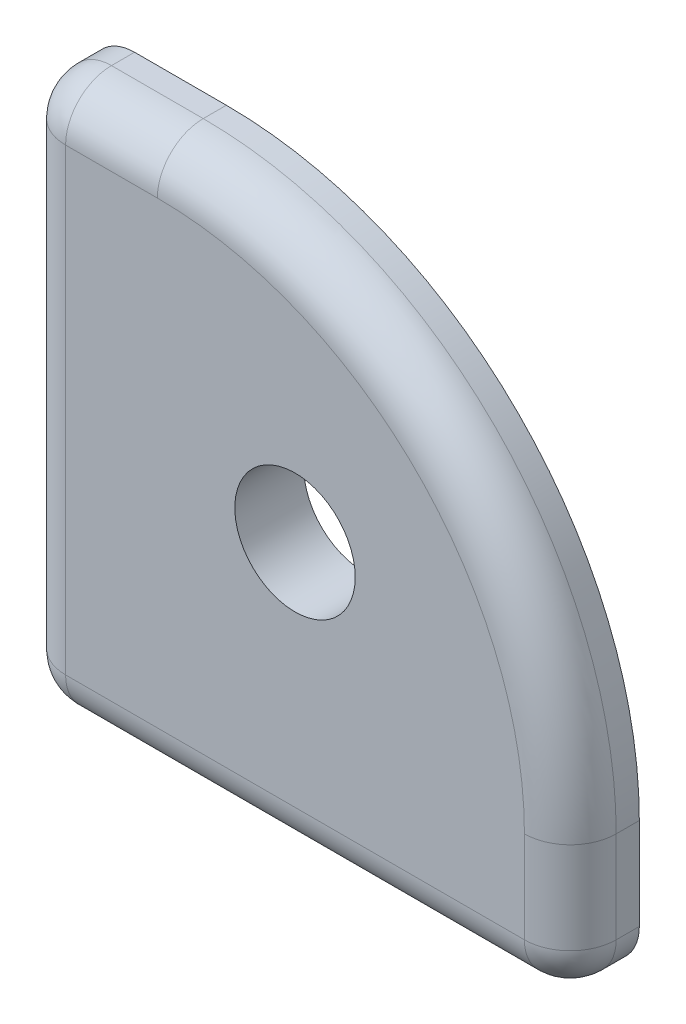
ISO-10303-21;
HEADER;
FILE_DESCRIPTION(('STEP AP214'),'2;1');
FILE_NAME('part.step','',(''),(''),'','','');
FILE_SCHEMA(('AUTOMOTIVE_DESIGN { 1 0 10303 214 1 1 1 1 }'));
ENDSEC;
DATA;
#1=APPLICATION_CONTEXT('core data for automotive mechanical design processes');
#2=APPLICATION_PROTOCOL_DEFINITION('international standard','automotive_design',2000,#1);
#3=PRODUCT_CONTEXT('',#1,'mechanical');
#4=PRODUCT('Part','Part','',(#3));
#5=PRODUCT_RELATED_PRODUCT_CATEGORY('part','',(#4));
#6=PRODUCT_DEFINITION_FORMATION('','',#4);
#7=PRODUCT_DEFINITION_CONTEXT('part definition',#1,'design');
#8=PRODUCT_DEFINITION('design','',#6,#7);
#9=PRODUCT_DEFINITION_SHAPE('','',#8);
#10=(LENGTH_UNIT() NAMED_UNIT(*) SI_UNIT(.MILLI.,.METRE.));
#11=(NAMED_UNIT(*) PLANE_ANGLE_UNIT() SI_UNIT($,.RADIAN.));
#12=(NAMED_UNIT(*) SI_UNIT($,.STERADIAN.) SOLID_ANGLE_UNIT());
#13=UNCERTAINTY_MEASURE_WITH_UNIT(LENGTH_MEASURE(1.E-05),#10,'distance_accuracy_value','');
#14=(GEOMETRIC_REPRESENTATION_CONTEXT(3) GLOBAL_UNCERTAINTY_ASSIGNED_CONTEXT((#13)) GLOBAL_UNIT_ASSIGNED_CONTEXT((#10,
#11,#12)) REPRESENTATION_CONTEXT('',''));
#15=CARTESIAN_POINT('',(0.,0.,0.));
#16=DIRECTION('',(0.,0.,1.));
#17=DIRECTION('',(1.,0.,0.));
#18=AXIS2_PLACEMENT_3D('',#15,#16,#17);
#19=CARTESIAN_POINT('',(20.8940286291501,-16.6704350284402,0.));
#20=DIRECTION('',(0.,0.,1.));
#21=DIRECTION('',(1.,0.,0.));
#22=AXIS2_PLACEMENT_3D('',#19,#20,#21);
#23=PLANE('',#22);
#24=CARTESIAN_POINT('',(29.9110286291501,10.6489863277971,0.));
#25=DIRECTION('',(0.,0.,1.));
#26=DIRECTION('',(1.,0.,0.));
#27=AXIS2_PLACEMENT_3D('',#24,#25,#26);
#28=CIRCLE('',#27,1.2065);
#29=CARTESIAN_POINT('',(31.1175286291501,10.6489863277971,0.));
#30=VERTEX_POINT('',#29);
#31=EDGE_CURVE('E228',#30,#30,#28,.F.);
#32=ORIENTED_EDGE('',*,*,#31,.F.);
#33=EDGE_LOOP('',(#32));
#34=FACE_BOUND('',#33,.T.);
#35=CARTESIAN_POINT('',(20.8940286291501,25.3809863277971,0.));
#36=DIRECTION('',(0.,0.,1.));
#37=DIRECTION('',(1.,0.,0.));
#38=AXIS2_PLACEMENT_3D('',#35,#36,#37);
#39=CIRCLE('',#38,4.16559999999999);
#40=CARTESIAN_POINT('',(25.0596286291501,25.3809863277971,0.));
#41=VERTEX_POINT('',#40);
#42=EDGE_CURVE('E154',#41,#41,#39,.T.);
#43=ORIENTED_EDGE('',*,*,#42,.T.);
#44=EDGE_LOOP('',(#43));
#45=FACE_BOUND('',#44,.T.);
#46=DIRECTION('',(0.,1.,0.));
#47=VECTOR('',#46,1.);
#48=CARTESIAN_POINT('',(39.9440286291501,-16.6704350284402,0.));
#49=LINE('',#48,#47);
#50=CARTESIAN_POINT('',(39.9440286291501,9.50598632779709,0.));
#51=VERTEX_POINT('',#50);
#52=CARTESIAN_POINT('',(39.9440286291501,15.8559863277971,0.));
#53=VERTEX_POINT('',#52);
#54=EDGE_CURVE('E143',#51,#53,#49,.T.);
#55=ORIENTED_EDGE('',*,*,#54,.F.);
#56=CARTESIAN_POINT('',(36.7690286291501,9.50598632779709,0.));
#57=DIRECTION('',(0.,0.,1.));
#58=DIRECTION('',(1.,0.,0.));
#59=AXIS2_PLACEMENT_3D('',#56,#57,#58);
#60=CIRCLE('',#59,3.17499999999999);
#61=CARTESIAN_POINT('',(36.7690286291501,6.33098632779709,0.));
#62=VERTEX_POINT('',#61);
#63=EDGE_CURVE('E179',#62,#51,#60,.T.);
#64=ORIENTED_EDGE('',*,*,#63,.F.);
#65=DIRECTION('',(1.,0.,0.));
#66=VECTOR('',#65,1.);
#67=CARTESIAN_POINT('',(20.8940286291501,6.33098632779709,0.));
#68=LINE('',#67,#66);
#69=CARTESIAN_POINT('',(5.0190286291501,6.33098632779709,0.));
#70=VERTEX_POINT('',#69);
#71=EDGE_CURVE('E175',#70,#62,#68,.T.);
#72=ORIENTED_EDGE('',*,*,#71,.F.);
#73=CARTESIAN_POINT('',(5.0190286291501,9.50598632779709,0.));
#74=DIRECTION('',(0.,0.,1.));
#75=DIRECTION('',(1.,0.,0.));
#76=AXIS2_PLACEMENT_3D('',#73,#74,#75);
#77=CIRCLE('',#76,3.175);
#78=CARTESIAN_POINT('',(1.8440286291501,9.50598632779709,0.));
#79=VERTEX_POINT('',#78);
#80=EDGE_CURVE('E171',#79,#70,#77,.T.);
#81=ORIENTED_EDGE('',*,*,#80,.F.);
#82=DIRECTION('',(0.,-1.,0.));
#83=VECTOR('',#82,1.);
#84=CARTESIAN_POINT('',(1.8440286291501,-16.6704350284402,0.));
#85=LINE('',#84,#83);
#86=CARTESIAN_POINT('',(1.8440286291501,41.2559863277971,0.));
#87=VERTEX_POINT('',#86);
#88=EDGE_CURVE('E167',#87,#79,#85,.T.);
#89=ORIENTED_EDGE('',*,*,#88,.F.);
#90=CARTESIAN_POINT('',(5.0190286291501,41.2559863277971,0.));
#91=DIRECTION('',(0.,0.,1.));
#92=DIRECTION('',(1.,0.,0.));
#93=AXIS2_PLACEMENT_3D('',#90,#91,#92);
#94=CIRCLE('',#93,3.17499999999999);
#95=CARTESIAN_POINT('',(5.0190286291501,44.4309863277971,0.));
#96=VERTEX_POINT('',#95);
#97=EDGE_CURVE('E164',#96,#87,#94,.T.);
#98=ORIENTED_EDGE('',*,*,#97,.F.);
#99=DIRECTION('',(1.,0.,0.));
#100=VECTOR('',#99,1.);
#101=CARTESIAN_POINT('',(20.8940286291501,44.4309863277971,0.));
#102=LINE('',#101,#100);
#103=CARTESIAN_POINT('',(11.3690286291501,44.4309863277971,0.));
#104=VERTEX_POINT('',#103);
#105=EDGE_CURVE('E146',#96,#104,#102,.T.);
#106=ORIENTED_EDGE('',*,*,#105,.T.);
#107=CARTESIAN_POINT('',(11.3690286291501,15.8559863277971,0.));
#108=DIRECTION('',(0.,0.,1.));
#109=DIRECTION('',(1.,0.,0.));
#110=AXIS2_PLACEMENT_3D('',#107,#108,#109);
#111=CIRCLE('',#110,28.575);
#112=EDGE_CURVE('E130',#53,#104,#111,.T.);
#113=ORIENTED_EDGE('',*,*,#112,.F.);
#114=EDGE_LOOP('',(#55,#64,#72,#81,#89,#98,#106,#113));
#115=FACE_BOUND('',#114,.T.);
#116=CARTESIAN_POINT('',(11.8770286291501,40.1129863277971,0.));
#117=DIRECTION('',(0.,0.,1.));
#118=DIRECTION('',(1.,0.,0.));
#119=AXIS2_PLACEMENT_3D('',#116,#117,#118);
#120=CIRCLE('',#119,1.2065);
#121=CARTESIAN_POINT('',(13.0835286291501,40.1129863277971,0.));
#122=VERTEX_POINT('',#121);
#123=EDGE_CURVE('E257',#122,#122,#120,.F.);
#124=ORIENTED_EDGE('',*,*,#123,.F.);
#125=EDGE_LOOP('',(#124));
#126=FACE_BOUND('',#125,.T.);
#127=ADVANCED_FACE('F40',(#34,#45,#115,#126),#23,.F.);
#128=CARTESIAN_POINT('',(39.9440286291501,-16.6704350284402,4.7752));
#129=DIRECTION('',(-1.,0.,0.));
#130=DIRECTION('',(0.,0.,1.));
#131=AXIS2_PLACEMENT_3D('',#128,#129,#130);
#132=PLANE('',#131);
#133=DIRECTION('',(0.,0.,-1.));
#134=VECTOR('',#133,1.);
#135=CARTESIAN_POINT('',(39.9440286291501,15.8559863277971,4.7752));
#136=LINE('',#135,#134);
#137=CARTESIAN_POINT('',(39.9440286291501,15.8559863277971,1.6002));
#138=VERTEX_POINT('',#137);
#139=EDGE_CURVE('E127',#138,#53,#136,.T.);
#140=ORIENTED_EDGE('',*,*,#139,.F.);
#141=DIRECTION('',(0.,1.,0.));
#142=VECTOR('',#141,1.);
#143=CARTESIAN_POINT('',(39.9440286291501,9.50598632779709,1.6002));
#144=LINE('',#143,#142);
#145=CARTESIAN_POINT('',(39.9440286291501,9.50598632779709,1.6002));
#146=VERTEX_POINT('',#145);
#147=EDGE_CURVE('E223',#138,#146,#144,.F.);
#148=ORIENTED_EDGE('',*,*,#147,.T.);
#149=DIRECTION('',(0.,0.,-1.));
#150=VECTOR('',#149,1.);
#151=CARTESIAN_POINT('',(39.9440286291501,9.50598632779709,4.7752));
#152=LINE('',#151,#150);
#153=EDGE_CURVE('E151',#146,#51,#152,.T.);
#154=ORIENTED_EDGE('',*,*,#153,.T.);
#155=ORIENTED_EDGE('',*,*,#54,.T.);
#156=EDGE_LOOP('',(#140,#148,#154,#155));
#157=FACE_BOUND('',#156,.T.);
#158=ADVANCED_FACE('F149',(#157),#132,.F.);
#159=CARTESIAN_POINT('',(11.3690286291501,15.8559863277971,4.7752));
#160=DIRECTION('',(0.,0.,-1.));
#161=DIRECTION('',(-1.,0.,0.));
#162=AXIS2_PLACEMENT_3D('',#159,#160,#161);
#163=CYLINDRICAL_SURFACE('',#162,28.575);
#164=DIRECTION('',(0.,0.,-1.));
#165=VECTOR('',#164,1.);
#166=CARTESIAN_POINT('',(11.3690286291501,44.4309863277971,4.7752));
#167=LINE('',#166,#165);
#168=CARTESIAN_POINT('',(11.3690286291501,44.4309863277971,1.6002));
#169=VERTEX_POINT('',#168);
#170=EDGE_CURVE('E137',#169,#104,#167,.T.);
#171=ORIENTED_EDGE('',*,*,#170,.F.);
#172=CARTESIAN_POINT('',(11.3690286291501,15.8559863277971,1.6002));
#173=DIRECTION('',(0.,0.,1.));
#174=DIRECTION('',(1.,0.,0.));
#175=AXIS2_PLACEMENT_3D('',#172,#173,#174);
#176=CIRCLE('',#175,28.575);
#177=EDGE_CURVE('E65',#169,#138,#176,.F.);
#178=ORIENTED_EDGE('',*,*,#177,.T.);
#179=ORIENTED_EDGE('',*,*,#139,.T.);
#180=ORIENTED_EDGE('',*,*,#112,.T.);
#181=EDGE_LOOP('',(#171,#178,#179,#180));
#182=FACE_BOUND('',#181,.T.);
#183=ADVANCED_FACE('F129',(#182),#163,.T.);
#184=CARTESIAN_POINT('',(20.8940286291501,44.4309863277971,4.7752));
#185=DIRECTION('',(0.,1.,0.));
#186=DIRECTION('',(0.,0.,1.));
#187=AXIS2_PLACEMENT_3D('',#184,#185,#186);
#188=PLANE('',#187);
#189=DIRECTION('',(0.,0.,-1.));
#190=VECTOR('',#189,1.);
#191=CARTESIAN_POINT('',(5.0190286291501,44.4309863277971,4.7752));
#192=LINE('',#191,#190);
#193=CARTESIAN_POINT('',(5.0190286291501,44.4309863277971,1.6002));
#194=VERTEX_POINT('',#193);
#195=EDGE_CURVE('E193',#194,#96,#192,.T.);
#196=ORIENTED_EDGE('',*,*,#195,.F.);
#197=DIRECTION('',(1.,0.,0.));
#198=VECTOR('',#197,1.);
#199=CARTESIAN_POINT('',(20.8940286291501,44.4309863277971,1.6002));
#200=LINE('',#199,#198);
#201=EDGE_CURVE('E55',#194,#169,#200,.T.);
#202=ORIENTED_EDGE('',*,*,#201,.T.);
#203=ORIENTED_EDGE('',*,*,#170,.T.);
#204=ORIENTED_EDGE('',*,*,#105,.F.);
#205=EDGE_LOOP('',(#196,#202,#203,#204));
#206=FACE_BOUND('',#205,.T.);
#207=ADVANCED_FACE('F309',(#206),#188,.T.);
#208=CARTESIAN_POINT('',(5.0190286291501,41.2559863277971,4.7752));
#209=DIRECTION('',(0.,0.,-1.));
#210=DIRECTION('',(-1.,0.,0.));
#211=AXIS2_PLACEMENT_3D('',#208,#209,#210);
#212=CYLINDRICAL_SURFACE('',#211,3.17499999999999);
#213=DIRECTION('',(0.,0.,-1.));
#214=VECTOR('',#213,1.);
#215=CARTESIAN_POINT('',(1.8440286291501,41.2559863277971,4.7752));
#216=LINE('',#215,#214);
#217=CARTESIAN_POINT('',(1.8440286291501,41.2559863277971,1.6002));
#218=VERTEX_POINT('',#217);
#219=EDGE_CURVE('E191',#218,#87,#216,.T.);
#220=ORIENTED_EDGE('',*,*,#219,.F.);
#221=CARTESIAN_POINT('',(5.0190286291501,41.2559863277971,1.6002));
#222=DIRECTION('',(0.,0.,-1.));
#223=DIRECTION('',(-1.,0.,0.));
#224=AXIS2_PLACEMENT_3D('',#221,#222,#223);
#225=CIRCLE('',#224,3.17499999999999);
#226=EDGE_CURVE('E136',#218,#194,#225,.T.);
#227=ORIENTED_EDGE('',*,*,#226,.T.);
#228=ORIENTED_EDGE('',*,*,#195,.T.);
#229=ORIENTED_EDGE('',*,*,#97,.T.);
#230=EDGE_LOOP('',(#220,#227,#228,#229));
#231=FACE_BOUND('',#230,.T.);
#232=ADVANCED_FACE('F305',(#231),#212,.T.);
#233=CARTESIAN_POINT('',(1.8440286291501,-16.6704350284402,4.7752));
#234=DIRECTION('',(1.,0.,0.));
#235=DIRECTION('',(0.,0.,-1.));
#236=AXIS2_PLACEMENT_3D('',#233,#234,#235);
#237=PLANE('',#236);
#238=DIRECTION('',(0.,0.,-1.));
#239=VECTOR('',#238,1.);
#240=CARTESIAN_POINT('',(1.8440286291501,9.50598632779709,4.7752));
#241=LINE('',#240,#239);
#242=CARTESIAN_POINT('',(1.8440286291501,9.50598632779709,1.6002));
#243=VERTEX_POINT('',#242);
#244=EDGE_CURVE('E188',#243,#79,#241,.T.);
#245=ORIENTED_EDGE('',*,*,#244,.F.);
#246=DIRECTION('',(0.,-1.,0.));
#247=VECTOR('',#246,1.);
#248=CARTESIAN_POINT('',(1.8440286291501,41.2559863277971,1.6002));
#249=LINE('',#248,#247);
#250=EDGE_CURVE('E213',#243,#218,#249,.F.);
#251=ORIENTED_EDGE('',*,*,#250,.T.);
#252=ORIENTED_EDGE('',*,*,#219,.T.);
#253=ORIENTED_EDGE('',*,*,#88,.T.);
#254=EDGE_LOOP('',(#245,#251,#252,#253));
#255=FACE_BOUND('',#254,.T.);
#256=ADVANCED_FACE('F301',(#255),#237,.F.);
#257=CARTESIAN_POINT('',(5.0190286291501,9.50598632779709,4.7752));
#258=DIRECTION('',(0.,0.,-1.));
#259=DIRECTION('',(-1.,0.,0.));
#260=AXIS2_PLACEMENT_3D('',#257,#258,#259);
#261=CYLINDRICAL_SURFACE('',#260,3.175);
#262=DIRECTION('',(0.,0.,-1.));
#263=VECTOR('',#262,1.);
#264=CARTESIAN_POINT('',(5.0190286291501,6.33098632779709,4.7752));
#265=LINE('',#264,#263);
#266=CARTESIAN_POINT('',(5.0190286291501,6.33098632779709,1.6002));
#267=VERTEX_POINT('',#266);
#268=EDGE_CURVE('E185',#267,#70,#265,.T.);
#269=ORIENTED_EDGE('',*,*,#268,.F.);
#270=CARTESIAN_POINT('',(5.0190286291501,9.50598632779709,1.6002));
#271=DIRECTION('',(0.,0.,-1.));
#272=DIRECTION('',(-1.,0.,0.));
#273=AXIS2_PLACEMENT_3D('',#270,#271,#272);
#274=CIRCLE('',#273,3.175);
#275=EDGE_CURVE('E216',#267,#243,#274,.T.);
#276=ORIENTED_EDGE('',*,*,#275,.T.);
#277=ORIENTED_EDGE('',*,*,#244,.T.);
#278=ORIENTED_EDGE('',*,*,#80,.T.);
#279=EDGE_LOOP('',(#269,#276,#277,#278));
#280=FACE_BOUND('',#279,.T.);
#281=ADVANCED_FACE('F297',(#280),#261,.T.);
#282=CARTESIAN_POINT('',(20.8940286291501,6.33098632779709,4.7752));
#283=DIRECTION('',(0.,1.,0.));
#284=DIRECTION('',(0.,0.,1.));
#285=AXIS2_PLACEMENT_3D('',#282,#283,#284);
#286=PLANE('',#285);
#287=DIRECTION('',(0.,0.,-1.));
#288=VECTOR('',#287,1.);
#289=CARTESIAN_POINT('',(36.7690286291501,6.33098632779709,4.7752));
#290=LINE('',#289,#288);
#291=CARTESIAN_POINT('',(36.7690286291501,6.33098632779709,1.6002));
#292=VERTEX_POINT('',#291);
#293=EDGE_CURVE('E183',#292,#62,#290,.T.);
#294=ORIENTED_EDGE('',*,*,#293,.F.);
#295=DIRECTION('',(1.,0.,0.));
#296=VECTOR('',#295,1.);
#297=CARTESIAN_POINT('',(5.0190286291501,6.33098632779709,1.6002));
#298=LINE('',#297,#296);
#299=EDGE_CURVE('E219',#292,#267,#298,.F.);
#300=ORIENTED_EDGE('',*,*,#299,.T.);
#301=ORIENTED_EDGE('',*,*,#268,.T.);
#302=ORIENTED_EDGE('',*,*,#71,.T.);
#303=EDGE_LOOP('',(#294,#300,#301,#302));
#304=FACE_BOUND('',#303,.T.);
#305=ADVANCED_FACE('F294',(#304),#286,.F.);
#306=CARTESIAN_POINT('',(20.8940286291501,25.3809863277971,4.7752));
#307=DIRECTION('',(0.,0.,-1.));
#308=DIRECTION('',(-1.,0.,0.));
#309=AXIS2_PLACEMENT_3D('',#306,#307,#308);
#310=CYLINDRICAL_SURFACE('',#309,4.16559999999999);
#311=CARTESIAN_POINT('',(20.8940286291501,25.3809863277971,4.7752));
#312=DIRECTION('',(0.,0.,1.));
#313=DIRECTION('',(1.,0.,0.));
#314=AXIS2_PLACEMENT_3D('',#311,#312,#313);
#315=CIRCLE('',#314,4.16559999999999);
#316=CARTESIAN_POINT('',(25.0596286291501,25.3809863277971,4.7752));
#317=VERTEX_POINT('',#316);
#318=EDGE_CURVE('E181',#317,#317,#315,.T.);
#319=ORIENTED_EDGE('',*,*,#318,.T.);
#320=EDGE_LOOP('',(#319));
#321=FACE_BOUND('',#320,.T.);
#322=ORIENTED_EDGE('',*,*,#42,.F.);
#323=EDGE_LOOP('',(#322));
#324=FACE_BOUND('',#323,.T.);
#325=ADVANCED_FACE('F292',(#321,#324),#310,.F.);
#326=CARTESIAN_POINT('',(36.7690286291501,9.50598632779709,4.7752));
#327=DIRECTION('',(0.,0.,-1.));
#328=DIRECTION('',(-1.,0.,0.));
#329=AXIS2_PLACEMENT_3D('',#326,#327,#328);
#330=CYLINDRICAL_SURFACE('',#329,3.17499999999999);
#331=ORIENTED_EDGE('',*,*,#153,.F.);
#332=CARTESIAN_POINT('',(36.7690286291501,9.50598632779709,1.6002));
#333=DIRECTION('',(0.,0.,-1.));
#334=DIRECTION('',(-1.,0.,0.));
#335=AXIS2_PLACEMENT_3D('',#332,#333,#334);
#336=CIRCLE('',#335,3.17499999999999);
#337=EDGE_CURVE('E221',#146,#292,#336,.T.);
#338=ORIENTED_EDGE('',*,*,#337,.T.);
#339=ORIENTED_EDGE('',*,*,#293,.T.);
#340=ORIENTED_EDGE('',*,*,#63,.T.);
#341=EDGE_LOOP('',(#331,#338,#339,#340));
#342=FACE_BOUND('',#341,.T.);
#343=ADVANCED_FACE('F289',(#342),#330,.T.);
#344=CARTESIAN_POINT('',(20.8940286291501,-16.6704350284402,4.7752));
#345=DIRECTION('',(0.,0.,1.));
#346=DIRECTION('',(1.,0.,0.));
#347=AXIS2_PLACEMENT_3D('',#344,#345,#346);
#348=PLANE('',#347);
#349=DIRECTION('',(1.,0.,0.));
#350=VECTOR('',#349,1.);
#351=CARTESIAN_POINT('',(20.8940286291501,41.2559863277971,4.7752));
#352=LINE('',#351,#350);
#353=CARTESIAN_POINT('',(11.3690286291501,41.2559863277971,4.7752));
#354=VERTEX_POINT('',#353);
#355=CARTESIAN_POINT('',(5.0190286291501,41.2559863277971,4.7752));
#356=VERTEX_POINT('',#355);
#357=EDGE_CURVE('E198',#354,#356,#352,.F.);
#358=ORIENTED_EDGE('',*,*,#357,.T.);
#359=DIRECTION('',(0.,-1.,0.));
#360=VECTOR('',#359,1.);
#361=CARTESIAN_POINT('',(5.0190286291501,9.50598632779709,4.7752));
#362=LINE('',#361,#360);
#363=CARTESIAN_POINT('',(5.0190286291501,9.50598632779709,4.7752));
#364=VERTEX_POINT('',#363);
#365=EDGE_CURVE('E209',#356,#364,#362,.T.);
#366=ORIENTED_EDGE('',*,*,#365,.T.);
#367=DIRECTION('',(1.,0.,0.));
#368=VECTOR('',#367,1.);
#369=CARTESIAN_POINT('',(36.7690286291501,9.50598632779709,4.7752));
#370=LINE('',#369,#368);
#371=CARTESIAN_POINT('',(36.7690286291501,9.50598632779709,4.7752));
#372=VERTEX_POINT('',#371);
#373=EDGE_CURVE('E206',#364,#372,#370,.T.);
#374=ORIENTED_EDGE('',*,*,#373,.T.);
#375=DIRECTION('',(0.,1.,0.));
#376=VECTOR('',#375,1.);
#377=CARTESIAN_POINT('',(36.7690286291501,15.8559863277971,4.7752));
#378=LINE('',#377,#376);
#379=CARTESIAN_POINT('',(36.7690286291501,15.8559863277971,4.7752));
#380=VERTEX_POINT('',#379);
#381=EDGE_CURVE('E203',#372,#380,#378,.T.);
#382=ORIENTED_EDGE('',*,*,#381,.T.);
#383=CARTESIAN_POINT('',(11.3690286291501,15.8559863277971,4.7752));
#384=DIRECTION('',(0.,0.,1.));
#385=DIRECTION('',(1.,0.,0.));
#386=AXIS2_PLACEMENT_3D('',#383,#384,#385);
#387=CIRCLE('',#386,25.4);
#388=EDGE_CURVE('E200',#380,#354,#387,.T.);
#389=ORIENTED_EDGE('',*,*,#388,.T.);
#390=EDGE_LOOP('',(#358,#366,#374,#382,#389));
#391=FACE_BOUND('',#390,.T.);
#392=ORIENTED_EDGE('',*,*,#318,.F.);
#393=EDGE_LOOP('',(#392));
#394=FACE_BOUND('',#393,.T.);
#395=ADVANCED_FACE('F287',(#391,#394),#348,.T.);
#396=CARTESIAN_POINT('',(36.7690286291501,9.50598632779709,1.6002));
#397=DIRECTION('',(0.,0.,1.));
#398=DIRECTION('',(1.,0.,0.));
#399=AXIS2_PLACEMENT_3D('',#396,#397,#398);
#400=SPHERICAL_SURFACE('',#399,3.175);
#401=CARTESIAN_POINT('',(36.7690286291501,9.5059863277971,1.6002));
#402=DIRECTION('',(-1.,0.,0.));
#403=DIRECTION('',(0.,0.,1.));
#404=AXIS2_PLACEMENT_3D('',#401,#402,#403);
#405=CIRCLE('',#404,3.175);
#406=EDGE_CURVE('E248',#292,#372,#405,.T.);
#407=ORIENTED_EDGE('',*,*,#406,.F.);
#408=ORIENTED_EDGE('',*,*,#337,.F.);
#409=CARTESIAN_POINT('',(36.7690286291501,9.50598632779709,1.6002));
#410=DIRECTION('',(0.,1.,0.));
#411=DIRECTION('',(-1.,0.,0.));
#412=AXIS2_PLACEMENT_3D('',#409,#410,#411);
#413=CIRCLE('',#412,3.175);
#414=EDGE_CURVE('E159',#372,#146,#413,.T.);
#415=ORIENTED_EDGE('',*,*,#414,.F.);
#416=EDGE_LOOP('',(#407,#408,#415));
#417=FACE_BOUND('',#416,.T.);
#418=ADVANCED_FACE('F344',(#417),#400,.T.);
#419=CARTESIAN_POINT('',(36.7690286291501,-16.6704350284402,1.6002));
#420=DIRECTION('',(0.,-1.,0.));
#421=DIRECTION('',(0.,0.,-1.));
#422=AXIS2_PLACEMENT_3D('',#419,#420,#421);
#423=CYLINDRICAL_SURFACE('',#422,3.175);
#424=ORIENTED_EDGE('',*,*,#414,.T.);
#425=ORIENTED_EDGE('',*,*,#147,.F.);
#426=CARTESIAN_POINT('',(36.7690286291501,15.8559863277971,1.6002));
#427=DIRECTION('',(0.,1.,0.));
#428=DIRECTION('',(0.,0.,1.));
#429=AXIS2_PLACEMENT_3D('',#426,#427,#428);
#430=CIRCLE('',#429,3.175);
#431=EDGE_CURVE('E244',#380,#138,#430,.T.);
#432=ORIENTED_EDGE('',*,*,#431,.F.);
#433=ORIENTED_EDGE('',*,*,#381,.F.);
#434=EDGE_LOOP('',(#424,#425,#432,#433));
#435=FACE_BOUND('',#434,.T.);
#436=ADVANCED_FACE('F341',(#435),#423,.T.);
#437=CARTESIAN_POINT('',(20.8940286291501,9.50598632779709,1.6002));
#438=DIRECTION('',(-1.,0.,0.));
#439=DIRECTION('',(0.,0.,1.));
#440=AXIS2_PLACEMENT_3D('',#437,#438,#439);
#441=CYLINDRICAL_SURFACE('',#440,3.175);
#442=ORIENTED_EDGE('',*,*,#406,.T.);
#443=ORIENTED_EDGE('',*,*,#373,.F.);
#444=CARTESIAN_POINT('',(5.0190286291501,9.50598632779709,1.6002));
#445=DIRECTION('',(-1.,0.,0.));
#446=DIRECTION('',(0.,0.,1.));
#447=AXIS2_PLACEMENT_3D('',#444,#445,#446);
#448=CIRCLE('',#447,3.175);
#449=EDGE_CURVE('E240',#267,#364,#448,.T.);
#450=ORIENTED_EDGE('',*,*,#449,.F.);
#451=ORIENTED_EDGE('',*,*,#299,.F.);
#452=EDGE_LOOP('',(#442,#443,#450,#451));
#453=FACE_BOUND('',#452,.T.);
#454=ADVANCED_FACE('F337',(#453),#441,.T.);
#455=CARTESIAN_POINT('',(11.3690286291501,15.8559863277971,1.6002));
#456=DIRECTION('',(0.,0.,1.));
#457=DIRECTION('',(1.,0.,0.));
#458=AXIS2_PLACEMENT_3D('',#455,#456,#457);
#459=TOROIDAL_SURFACE('',#458,25.4,3.175);
#460=ORIENTED_EDGE('',*,*,#431,.T.);
#461=ORIENTED_EDGE('',*,*,#177,.F.);
#462=CARTESIAN_POINT('',(11.3690286291501,41.2559863277971,1.6002));
#463=DIRECTION('',(-1.,0.,0.));
#464=DIRECTION('',(0.,0.,1.));
#465=AXIS2_PLACEMENT_3D('',#462,#463,#464);
#466=CIRCLE('',#465,3.175);
#467=EDGE_CURVE('E237',#354,#169,#466,.T.);
#468=ORIENTED_EDGE('',*,*,#467,.F.);
#469=ORIENTED_EDGE('',*,*,#388,.F.);
#470=EDGE_LOOP('',(#460,#461,#468,#469));
#471=FACE_BOUND('',#470,.T.);
#472=ADVANCED_FACE('F333',(#471),#459,.T.);
#473=CARTESIAN_POINT('',(5.0190286291501,9.50598632779709,1.6002));
#474=DIRECTION('',(0.,0.,1.));
#475=DIRECTION('',(1.,0.,0.));
#476=AXIS2_PLACEMENT_3D('',#473,#474,#475);
#477=SPHERICAL_SURFACE('',#476,3.175);
#478=ORIENTED_EDGE('',*,*,#275,.F.);
#479=ORIENTED_EDGE('',*,*,#449,.T.);
#480=CARTESIAN_POINT('',(5.0190286291501,9.50598632779709,1.6002));
#481=DIRECTION('',(0.,1.,0.));
#482=DIRECTION('',(-1.,0.,0.));
#483=AXIS2_PLACEMENT_3D('',#480,#481,#482);
#484=CIRCLE('',#483,3.175);
#485=EDGE_CURVE('E234',#243,#364,#484,.T.);
#486=ORIENTED_EDGE('',*,*,#485,.F.);
#487=EDGE_LOOP('',(#478,#479,#486));
#488=FACE_BOUND('',#487,.T.);
#489=ADVANCED_FACE('F329',(#488),#477,.T.);
#490=CARTESIAN_POINT('',(20.8940286291501,41.2559863277971,1.6002));
#491=DIRECTION('',(1.,0.,0.));
#492=DIRECTION('',(0.,0.,-1.));
#493=AXIS2_PLACEMENT_3D('',#490,#491,#492);
#494=CYLINDRICAL_SURFACE('',#493,3.175);
#495=ORIENTED_EDGE('',*,*,#467,.T.);
#496=ORIENTED_EDGE('',*,*,#201,.F.);
#497=CARTESIAN_POINT('',(5.0190286291501,41.2559863277971,1.6002));
#498=DIRECTION('',(-1.,0.,0.));
#499=DIRECTION('',(0.,-1.,0.));
#500=AXIS2_PLACEMENT_3D('',#497,#498,#499);
#501=CIRCLE('',#500,3.175);
#502=EDGE_CURVE('E232',#356,#194,#501,.T.);
#503=ORIENTED_EDGE('',*,*,#502,.F.);
#504=ORIENTED_EDGE('',*,*,#357,.F.);
#505=EDGE_LOOP('',(#495,#496,#503,#504));
#506=FACE_BOUND('',#505,.T.);
#507=ADVANCED_FACE('F325',(#506),#494,.T.);
#508=CARTESIAN_POINT('',(5.0190286291501,-16.6704350284402,1.6002));
#509=DIRECTION('',(0.,1.,0.));
#510=DIRECTION('',(0.,0.,1.));
#511=AXIS2_PLACEMENT_3D('',#508,#509,#510);
#512=CYLINDRICAL_SURFACE('',#511,3.175);
#513=ORIENTED_EDGE('',*,*,#485,.T.);
#514=ORIENTED_EDGE('',*,*,#365,.F.);
#515=CARTESIAN_POINT('',(5.0190286291501,41.2559863277971,1.6002));
#516=DIRECTION('',(0.,1.,0.));
#517=DIRECTION('',(0.,0.,1.));
#518=AXIS2_PLACEMENT_3D('',#515,#516,#517);
#519=CIRCLE('',#518,3.175);
#520=EDGE_CURVE('E229',#218,#356,#519,.T.);
#521=ORIENTED_EDGE('',*,*,#520,.F.);
#522=ORIENTED_EDGE('',*,*,#250,.F.);
#523=EDGE_LOOP('',(#513,#514,#521,#522));
#524=FACE_BOUND('',#523,.T.);
#525=ADVANCED_FACE('F321',(#524),#512,.T.);
#526=CARTESIAN_POINT('',(5.0190286291501,41.2559863277971,1.6002));
#527=DIRECTION('',(0.,0.,1.));
#528=DIRECTION('',(1.,0.,0.));
#529=AXIS2_PLACEMENT_3D('',#526,#527,#528);
#530=SPHERICAL_SURFACE('',#529,3.175);
#531=ORIENTED_EDGE('',*,*,#502,.T.);
#532=ORIENTED_EDGE('',*,*,#226,.F.);
#533=ORIENTED_EDGE('',*,*,#520,.T.);
#534=EDGE_LOOP('',(#531,#532,#533));
#535=FACE_BOUND('',#534,.T.);
#536=ADVANCED_FACE('F318',(#535),#530,.T.);
#537=CARTESIAN_POINT('',(29.9110286291501,10.6489863277971,-2.4892));
#538=DIRECTION('',(0.,0.,1.));
#539=DIRECTION('',(1.,0.,0.));
#540=AXIS2_PLACEMENT_3D('',#537,#538,#539);
#541=CYLINDRICAL_SURFACE('',#540,1.2065);
#542=CARTESIAN_POINT('',(29.9110286291501,10.6489863277971,-1.2827));
#543=DIRECTION('',(0.,0.,1.));
#544=DIRECTION('',(1.,0.,0.));
#545=AXIS2_PLACEMENT_3D('',#542,#543,#544);
#546=CIRCLE('',#545,1.2065);
#547=CARTESIAN_POINT('',(31.1175286291501,10.6489863277971,-1.2827));
#548=VERTEX_POINT('',#547);
#549=EDGE_CURVE('E48',#548,#548,#546,.T.);
#550=ORIENTED_EDGE('',*,*,#549,.T.);
#551=EDGE_LOOP('',(#550));
#552=FACE_BOUND('',#551,.T.);
#553=ORIENTED_EDGE('',*,*,#31,.T.);
#554=EDGE_LOOP('',(#553));
#555=FACE_BOUND('',#554,.T.);
#556=ADVANCED_FACE('F262',(#552,#555),#541,.T.);
#557=CARTESIAN_POINT('',(11.8770286291501,40.1129863277971,-2.4892));
#558=DIRECTION('',(0.,0.,1.));
#559=DIRECTION('',(1.,0.,0.));
#560=AXIS2_PLACEMENT_3D('',#557,#558,#559);
#561=CYLINDRICAL_SURFACE('',#560,1.2065);
#562=CARTESIAN_POINT('',(11.8770286291501,40.1129863277971,-1.2827));
#563=DIRECTION('',(0.,0.,1.));
#564=DIRECTION('',(1.,0.,0.));
#565=AXIS2_PLACEMENT_3D('',#562,#563,#564);
#566=CIRCLE('',#565,1.2065);
#567=CARTESIAN_POINT('',(13.0835286291501,40.1129863277971,-1.2827));
#568=VERTEX_POINT('',#567);
#569=EDGE_CURVE('E11',#568,#568,#566,.T.);
#570=ORIENTED_EDGE('',*,*,#569,.T.);
#571=EDGE_LOOP('',(#570));
#572=FACE_BOUND('',#571,.T.);
#573=ORIENTED_EDGE('',*,*,#123,.T.);
#574=EDGE_LOOP('',(#573));
#575=FACE_BOUND('',#574,.T.);
#576=ADVANCED_FACE('F267',(#572,#575),#561,.T.);
#577=CARTESIAN_POINT('',(29.9110286291501,10.6489863277971,-1.2827));
#578=DIRECTION('',(0.,0.,1.));
#579=DIRECTION('',(1.,0.,0.));
#580=AXIS2_PLACEMENT_3D('',#577,#578,#579);
#581=SPHERICAL_SURFACE('',#580,1.2065);
#582=ORIENTED_EDGE('',*,*,#549,.F.);
#583=EDGE_LOOP('',(#582));
#584=FACE_BOUND('',#583,.T.);
#585=ADVANCED_FACE('F265',(#584),#581,.T.);
#586=CARTESIAN_POINT('',(11.8770286291501,40.1129863277971,-1.2827));
#587=DIRECTION('',(0.,0.,1.));
#588=DIRECTION('',(1.,0.,0.));
#589=AXIS2_PLACEMENT_3D('',#586,#587,#588);
#590=SPHERICAL_SURFACE('',#589,1.2065);
#591=ORIENTED_EDGE('',*,*,#569,.F.);
#592=EDGE_LOOP('',(#591));
#593=FACE_BOUND('',#592,.T.);
#594=ADVANCED_FACE('F42',(#593),#590,.T.);
#595=CLOSED_SHELL('',(#127,#158,#183,#207,#232,#256,#281,#305,#325,#343,#395,#418,#436,#454,
#472,#489,#507,#525,#536,#556,#576,#585,#594));
#596=MANIFOLD_SOLID_BREP('B2',#595);
#597=ADVANCED_BREP_SHAPE_REPRESENTATION('',(#18,#596),#14);
#598=SHAPE_DEFINITION_REPRESENTATION(#9,#597);
ENDSEC;
END-ISO-10303-21;
